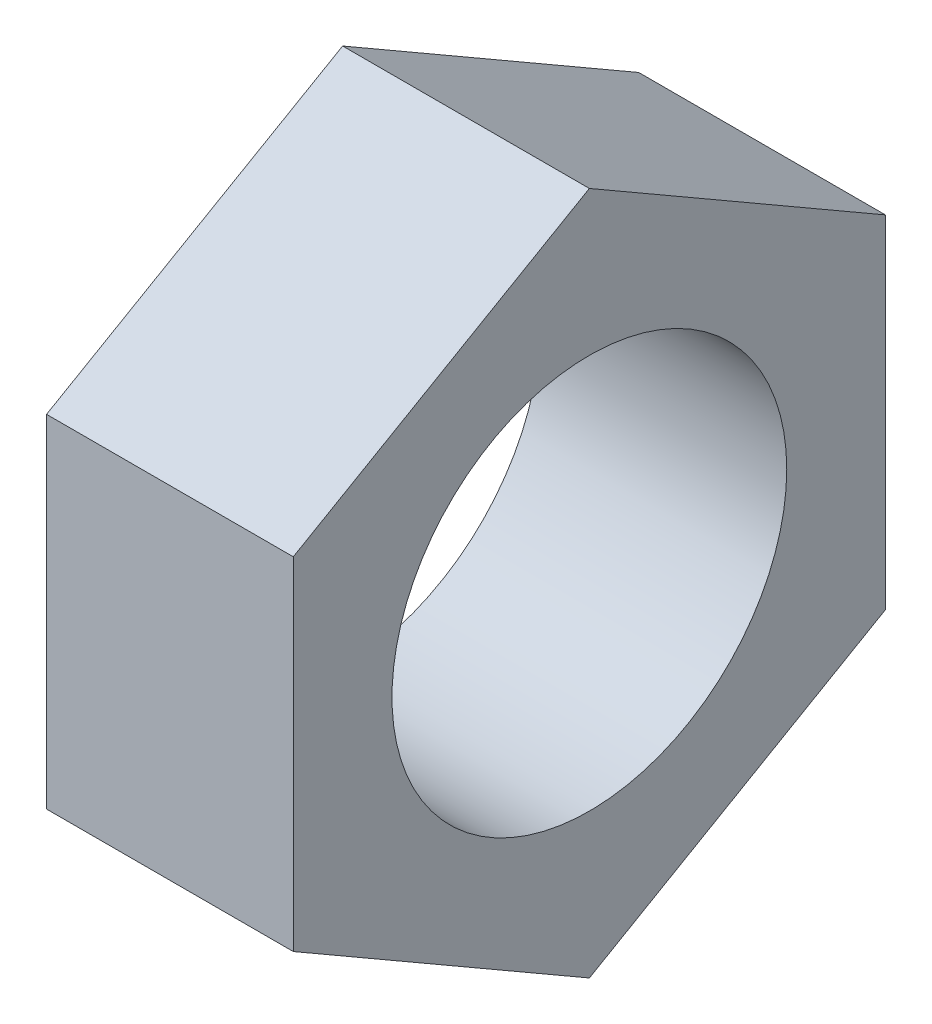
ISO-10303-21;
HEADER;
FILE_DESCRIPTION(('STEP AP214'),'2;1');
FILE_NAME('part.step','',(''),(''),'','','');
FILE_SCHEMA(('AUTOMOTIVE_DESIGN { 1 0 10303 214 1 1 1 1 }'));
ENDSEC;
DATA;
#1=APPLICATION_CONTEXT('core data for automotive mechanical design processes');
#2=APPLICATION_PROTOCOL_DEFINITION('international standard','automotive_design',2000,#1);
#3=PRODUCT_CONTEXT('',#1,'mechanical');
#4=PRODUCT('Part','Part','',(#3));
#5=PRODUCT_RELATED_PRODUCT_CATEGORY('part','',(#4));
#6=PRODUCT_DEFINITION_FORMATION('','',#4);
#7=PRODUCT_DEFINITION_CONTEXT('part definition',#1,'design');
#8=PRODUCT_DEFINITION('design','',#6,#7);
#9=PRODUCT_DEFINITION_SHAPE('','',#8);
#10=(LENGTH_UNIT() NAMED_UNIT(*) SI_UNIT(.MILLI.,.METRE.));
#11=(NAMED_UNIT(*) PLANE_ANGLE_UNIT() SI_UNIT($,.RADIAN.));
#12=(NAMED_UNIT(*) SI_UNIT($,.STERADIAN.) SOLID_ANGLE_UNIT());
#13=UNCERTAINTY_MEASURE_WITH_UNIT(LENGTH_MEASURE(1.E-05),#10,'distance_accuracy_value','');
#14=(GEOMETRIC_REPRESENTATION_CONTEXT(3) GLOBAL_UNCERTAINTY_ASSIGNED_CONTEXT((#13)) GLOBAL_UNIT_ASSIGNED_CONTEXT((#10,
#11,#12)) REPRESENTATION_CONTEXT('',''));
#15=CARTESIAN_POINT('',(0.,0.,0.));
#16=DIRECTION('',(0.,0.,1.));
#17=DIRECTION('',(1.,0.,0.));
#18=AXIS2_PLACEMENT_3D('',#15,#16,#17);
#19=CARTESIAN_POINT('',(5.,0.,-6.));
#20=DIRECTION('',(0.,0.,1.));
#21=DIRECTION('',(0.,-1.,0.));
#22=AXIS2_PLACEMENT_3D('',#19,#20,#21);
#23=PLANE('',#22);
#24=DIRECTION('',(0.,1.,0.));
#25=VECTOR('',#24,1.);
#26=CARTESIAN_POINT('',(0.,0.,-6.));
#27=LINE('',#26,#25);
#28=CARTESIAN_POINT('',(0.,-3.46410161513776,-6.));
#29=VERTEX_POINT('',#28);
#30=CARTESIAN_POINT('',(0.,3.46410161513776,-6.));
#31=VERTEX_POINT('',#30);
#32=EDGE_CURVE('E135',#29,#31,#27,.T.);
#33=ORIENTED_EDGE('',*,*,#32,.T.);
#34=DIRECTION('',(-1.,0.,0.));
#35=VECTOR('',#34,1.);
#36=CARTESIAN_POINT('',(5.,3.46410161513776,-6.));
#37=LINE('',#36,#35);
#38=CARTESIAN_POINT('',(5.,3.46410161513776,-6.));
#39=VERTEX_POINT('',#38);
#40=EDGE_CURVE('E11',#39,#31,#37,.T.);
#41=ORIENTED_EDGE('',*,*,#40,.F.);
#42=DIRECTION('',(0.,1.,0.));
#43=VECTOR('',#42,1.);
#44=CARTESIAN_POINT('',(5.,0.,-6.));
#45=LINE('',#44,#43);
#46=CARTESIAN_POINT('',(5.,-3.46410161513776,-6.));
#47=VERTEX_POINT('',#46);
#48=EDGE_CURVE('E168',#47,#39,#45,.T.);
#49=ORIENTED_EDGE('',*,*,#48,.F.);
#50=DIRECTION('',(-1.,0.,0.));
#51=VECTOR('',#50,1.);
#52=CARTESIAN_POINT('',(5.,-3.46410161513776,-6.));
#53=LINE('',#52,#51);
#54=EDGE_CURVE('E127',#47,#29,#53,.T.);
#55=ORIENTED_EDGE('',*,*,#54,.T.);
#56=EDGE_LOOP('',(#33,#41,#49,#55));
#57=FACE_BOUND('',#56,.T.);
#58=ADVANCED_FACE('F41',(#57),#23,.F.);
#59=CARTESIAN_POINT('',(5.,5.19615242270663,-3.));
#60=DIRECTION('',(0.,-0.866025403784439,0.5));
#61=DIRECTION('',(0.,-0.5,-0.866025403784439));
#62=AXIS2_PLACEMENT_3D('',#59,#60,#61);
#63=PLANE('',#62);
#64=DIRECTION('',(0.,0.5,0.866025403784439));
#65=VECTOR('',#64,1.);
#66=CARTESIAN_POINT('',(0.,5.19615242270663,-3.));
#67=LINE('',#66,#65);
#68=CARTESIAN_POINT('',(0.,6.92820323027551,0.));
#69=VERTEX_POINT('',#68);
#70=EDGE_CURVE('E139',#31,#69,#67,.T.);
#71=ORIENTED_EDGE('',*,*,#70,.T.);
#72=DIRECTION('',(-1.,0.,0.));
#73=VECTOR('',#72,1.);
#74=CARTESIAN_POINT('',(5.,6.92820323027551,0.));
#75=LINE('',#74,#73);
#76=CARTESIAN_POINT('',(5.,6.92820323027551,0.));
#77=VERTEX_POINT('',#76);
#78=EDGE_CURVE('E51',#77,#69,#75,.T.);
#79=ORIENTED_EDGE('',*,*,#78,.F.);
#80=DIRECTION('',(0.,0.5,0.866025403784439));
#81=VECTOR('',#80,1.);
#82=CARTESIAN_POINT('',(5.,5.19615242270663,-3.));
#83=LINE('',#82,#81);
#84=EDGE_CURVE('E96',#39,#77,#83,.T.);
#85=ORIENTED_EDGE('',*,*,#84,.F.);
#86=ORIENTED_EDGE('',*,*,#40,.T.);
#87=EDGE_LOOP('',(#71,#79,#85,#86));
#88=FACE_BOUND('',#87,.T.);
#89=ADVANCED_FACE('F182',(#88),#63,.F.);
#90=CARTESIAN_POINT('',(5.,5.19615242270663,3.));
#91=DIRECTION('',(0.,-0.866025403784439,-0.5));
#92=DIRECTION('',(0.,0.5,-0.866025403784439));
#93=AXIS2_PLACEMENT_3D('',#90,#91,#92);
#94=PLANE('',#93);
#95=DIRECTION('',(0.,-0.5,0.866025403784439));
#96=VECTOR('',#95,1.);
#97=CARTESIAN_POINT('',(0.,5.19615242270663,3.));
#98=LINE('',#97,#96);
#99=CARTESIAN_POINT('',(0.,3.46410161513776,6.));
#100=VERTEX_POINT('',#99);
#101=EDGE_CURVE('E142',#69,#100,#98,.T.);
#102=ORIENTED_EDGE('',*,*,#101,.T.);
#103=DIRECTION('',(-1.,0.,0.));
#104=VECTOR('',#103,1.);
#105=CARTESIAN_POINT('',(5.,3.46410161513776,6.));
#106=LINE('',#105,#104);
#107=CARTESIAN_POINT('',(5.,3.46410161513776,6.));
#108=VERTEX_POINT('',#107);
#109=EDGE_CURVE('E120',#108,#100,#106,.T.);
#110=ORIENTED_EDGE('',*,*,#109,.F.);
#111=DIRECTION('',(0.,-0.5,0.866025403784439));
#112=VECTOR('',#111,1.);
#113=CARTESIAN_POINT('',(5.,5.19615242270663,3.));
#114=LINE('',#113,#112);
#115=EDGE_CURVE('E109',#77,#108,#114,.T.);
#116=ORIENTED_EDGE('',*,*,#115,.F.);
#117=ORIENTED_EDGE('',*,*,#78,.T.);
#118=EDGE_LOOP('',(#102,#110,#116,#117));
#119=FACE_BOUND('',#118,.T.);
#120=ADVANCED_FACE('F161',(#119),#94,.F.);
#121=CARTESIAN_POINT('',(5.,0.,6.));
#122=DIRECTION('',(0.,0.,-1.));
#123=DIRECTION('',(-1.,0.,0.));
#124=AXIS2_PLACEMENT_3D('',#121,#122,#123);
#125=PLANE('',#124);
#126=DIRECTION('',(0.,-1.,0.));
#127=VECTOR('',#126,1.);
#128=CARTESIAN_POINT('',(0.,0.,6.));
#129=LINE('',#128,#127);
#130=CARTESIAN_POINT('',(0.,-3.46410161513776,6.));
#131=VERTEX_POINT('',#130);
#132=EDGE_CURVE('E118',#100,#131,#129,.T.);
#133=ORIENTED_EDGE('',*,*,#132,.T.);
#134=DIRECTION('',(-1.,0.,0.));
#135=VECTOR('',#134,1.);
#136=CARTESIAN_POINT('',(5.,-3.46410161513776,6.));
#137=LINE('',#136,#135);
#138=CARTESIAN_POINT('',(5.,-3.46410161513776,6.));
#139=VERTEX_POINT('',#138);
#140=EDGE_CURVE('E115',#139,#131,#137,.T.);
#141=ORIENTED_EDGE('',*,*,#140,.F.);
#142=DIRECTION('',(0.,-1.,0.));
#143=VECTOR('',#142,1.);
#144=CARTESIAN_POINT('',(5.,0.,6.));
#145=LINE('',#144,#143);
#146=EDGE_CURVE('E103',#108,#139,#145,.T.);
#147=ORIENTED_EDGE('',*,*,#146,.F.);
#148=ORIENTED_EDGE('',*,*,#109,.T.);
#149=EDGE_LOOP('',(#133,#141,#147,#148));
#150=FACE_BOUND('',#149,.T.);
#151=ADVANCED_FACE('F116',(#150),#125,.F.);
#152=CARTESIAN_POINT('',(5.,-5.19615242270663,3.));
#153=DIRECTION('',(0.,0.866025403784439,-0.5));
#154=DIRECTION('',(0.,0.5,0.866025403784439));
#155=AXIS2_PLACEMENT_3D('',#152,#153,#154);
#156=PLANE('',#155);
#157=DIRECTION('',(0.,-0.5,-0.866025403784439));
#158=VECTOR('',#157,1.);
#159=CARTESIAN_POINT('',(0.,-5.19615242270663,3.));
#160=LINE('',#159,#158);
#161=CARTESIAN_POINT('',(0.,-6.92820323027551,0.));
#162=VERTEX_POINT('',#161);
#163=EDGE_CURVE('E82',#131,#162,#160,.T.);
#164=ORIENTED_EDGE('',*,*,#163,.T.);
#165=DIRECTION('',(-1.,0.,0.));
#166=VECTOR('',#165,1.);
#167=CARTESIAN_POINT('',(5.,-6.92820323027551,0.));
#168=LINE('',#167,#166);
#169=CARTESIAN_POINT('',(5.,-6.92820323027551,0.));
#170=VERTEX_POINT('',#169);
#171=EDGE_CURVE('E121',#170,#162,#168,.T.);
#172=ORIENTED_EDGE('',*,*,#171,.F.);
#173=DIRECTION('',(0.,-0.5,-0.866025403784439));
#174=VECTOR('',#173,1.);
#175=CARTESIAN_POINT('',(5.,-5.19615242270663,3.));
#176=LINE('',#175,#174);
#177=EDGE_CURVE('E107',#139,#170,#176,.T.);
#178=ORIENTED_EDGE('',*,*,#177,.F.);
#179=ORIENTED_EDGE('',*,*,#140,.T.);
#180=EDGE_LOOP('',(#164,#172,#178,#179));
#181=FACE_BOUND('',#180,.T.);
#182=ADVANCED_FACE('F123',(#181),#156,.F.);
#183=CARTESIAN_POINT('',(5.,0.,0.));
#184=DIRECTION('',(-1.,0.,0.));
#185=DIRECTION('',(0.,0.,1.));
#186=AXIS2_PLACEMENT_3D('',#183,#184,#185);
#187=CYLINDRICAL_SURFACE('',#186,4.);
#188=CARTESIAN_POINT('',(5.,0.,0.));
#189=DIRECTION('',(1.,0.,0.));
#190=DIRECTION('',(0.,0.,-1.));
#191=AXIS2_PLACEMENT_3D('',#188,#189,#190);
#192=CIRCLE('',#191,4.);
#193=CARTESIAN_POINT('',(5.,0.,-4.));
#194=VERTEX_POINT('',#193);
#195=EDGE_CURVE('E151',#194,#194,#192,.T.);
#196=ORIENTED_EDGE('',*,*,#195,.T.);
#197=EDGE_LOOP('',(#196));
#198=FACE_BOUND('',#197,.T.);
#199=CARTESIAN_POINT('',(0.,0.,0.));
#200=DIRECTION('',(1.,0.,0.));
#201=DIRECTION('',(0.,0.,-1.));
#202=AXIS2_PLACEMENT_3D('',#199,#200,#201);
#203=CIRCLE('',#202,4.);
#204=CARTESIAN_POINT('',(0.,0.,-4.));
#205=VERTEX_POINT('',#204);
#206=EDGE_CURVE('E131',#205,#205,#203,.T.);
#207=ORIENTED_EDGE('',*,*,#206,.F.);
#208=EDGE_LOOP('',(#207));
#209=FACE_BOUND('',#208,.T.);
#210=ADVANCED_FACE('F43',(#198,#209),#187,.F.);
#211=CARTESIAN_POINT('',(5.,-5.19615242270663,-3.));
#212=DIRECTION('',(0.,0.866025403784439,0.5));
#213=DIRECTION('',(0.,-0.5,0.866025403784439));
#214=AXIS2_PLACEMENT_3D('',#211,#212,#213);
#215=PLANE('',#214);
#216=DIRECTION('',(0.,0.5,-0.866025403784439));
#217=VECTOR('',#216,1.);
#218=CARTESIAN_POINT('',(0.,-5.19615242270663,-3.));
#219=LINE('',#218,#217);
#220=EDGE_CURVE('E88',#162,#29,#219,.T.);
#221=ORIENTED_EDGE('',*,*,#220,.T.);
#222=ORIENTED_EDGE('',*,*,#54,.F.);
#223=DIRECTION('',(0.,0.5,-0.866025403784439));
#224=VECTOR('',#223,1.);
#225=CARTESIAN_POINT('',(5.,-5.19615242270663,-3.));
#226=LINE('',#225,#224);
#227=EDGE_CURVE('E59',#170,#47,#226,.T.);
#228=ORIENTED_EDGE('',*,*,#227,.F.);
#229=ORIENTED_EDGE('',*,*,#171,.T.);
#230=EDGE_LOOP('',(#221,#222,#228,#229));
#231=FACE_BOUND('',#230,.T.);
#232=ADVANCED_FACE('F169',(#231),#215,.F.);
#233=CARTESIAN_POINT('',(5.,0.,0.));
#234=DIRECTION('',(1.,0.,0.));
#235=DIRECTION('',(0.,0.,-1.));
#236=AXIS2_PLACEMENT_3D('',#233,#234,#235);
#237=PLANE('',#236);
#238=ORIENTED_EDGE('',*,*,#195,.F.);
#239=EDGE_LOOP('',(#238));
#240=FACE_BOUND('',#239,.T.);
#241=ORIENTED_EDGE('',*,*,#48,.T.);
#242=ORIENTED_EDGE('',*,*,#84,.T.);
#243=ORIENTED_EDGE('',*,*,#115,.T.);
#244=ORIENTED_EDGE('',*,*,#146,.T.);
#245=ORIENTED_EDGE('',*,*,#177,.T.);
#246=ORIENTED_EDGE('',*,*,#227,.T.);
#247=EDGE_LOOP('',(#241,#242,#243,#244,#245,#246));
#248=FACE_BOUND('',#247,.T.);
#249=ADVANCED_FACE('F105',(#240,#248),#237,.T.);
#250=CARTESIAN_POINT('',(0.,0.,0.));
#251=DIRECTION('',(1.,0.,0.));
#252=DIRECTION('',(0.,0.,-1.));
#253=AXIS2_PLACEMENT_3D('',#250,#251,#252);
#254=PLANE('',#253);
#255=ORIENTED_EDGE('',*,*,#206,.T.);
#256=EDGE_LOOP('',(#255));
#257=FACE_BOUND('',#256,.T.);
#258=ORIENTED_EDGE('',*,*,#32,.F.);
#259=ORIENTED_EDGE('',*,*,#220,.F.);
#260=ORIENTED_EDGE('',*,*,#163,.F.);
#261=ORIENTED_EDGE('',*,*,#132,.F.);
#262=ORIENTED_EDGE('',*,*,#101,.F.);
#263=ORIENTED_EDGE('',*,*,#70,.F.);
#264=EDGE_LOOP('',(#258,#259,#260,#261,#262,#263));
#265=FACE_BOUND('',#264,.T.);
#266=ADVANCED_FACE('F164',(#257,#265),#254,.F.);
#267=CLOSED_SHELL('',(#58,#89,#120,#151,#182,#210,#232,#249,#266));
#268=MANIFOLD_SOLID_BREP('B2',#267);
#269=ADVANCED_BREP_SHAPE_REPRESENTATION('',(#18,#268),#14);
#270=SHAPE_DEFINITION_REPRESENTATION(#9,#269);
ENDSEC;
END-ISO-10303-21;
